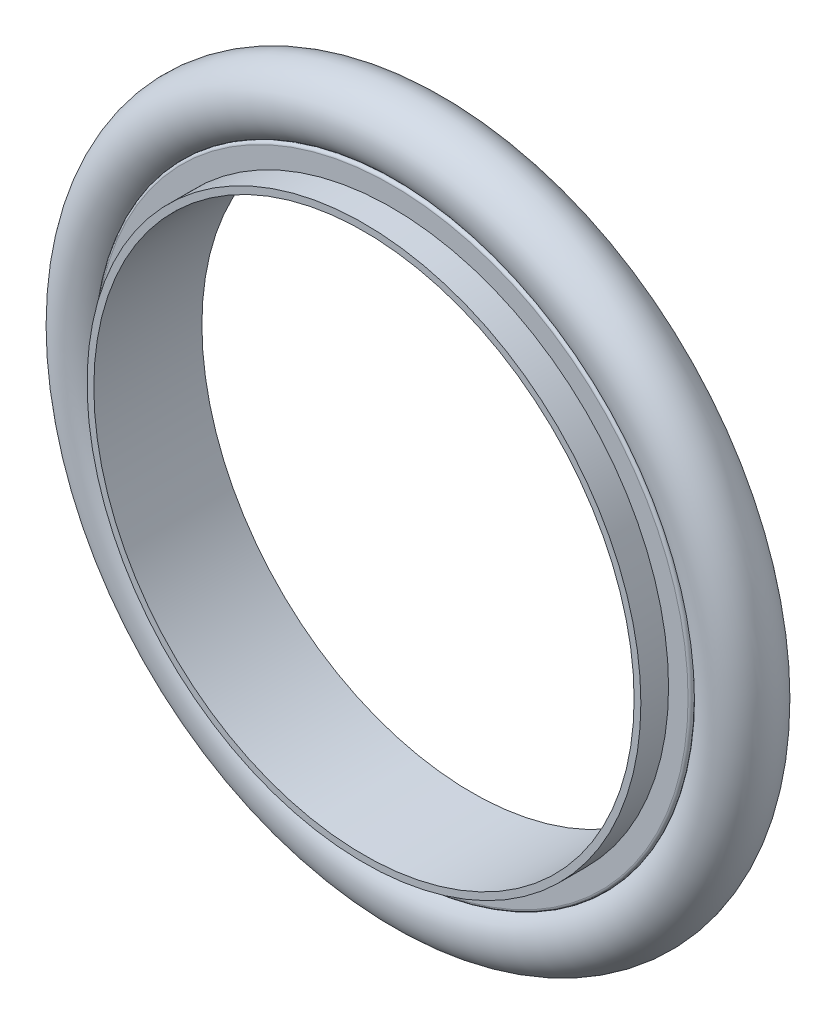
ISO-10303-21;
HEADER;
FILE_DESCRIPTION(('STEP AP214'),'2;1');
FILE_NAME('part.step','',(''),(''),'','','');
FILE_SCHEMA(('AUTOMOTIVE_DESIGN { 1 0 10303 214 1 1 1 1 }'));
ENDSEC;
DATA;
#1=APPLICATION_CONTEXT('core data for automotive mechanical design processes');
#2=APPLICATION_PROTOCOL_DEFINITION('international standard','automotive_design',2000,#1);
#3=PRODUCT_CONTEXT('',#1,'mechanical');
#4=PRODUCT('Part','Part','',(#3));
#5=PRODUCT_RELATED_PRODUCT_CATEGORY('part','',(#4));
#6=PRODUCT_DEFINITION_FORMATION('','',#4);
#7=PRODUCT_DEFINITION_CONTEXT('part definition',#1,'design');
#8=PRODUCT_DEFINITION('design','',#6,#7);
#9=PRODUCT_DEFINITION_SHAPE('','',#8);
#10=(LENGTH_UNIT() NAMED_UNIT(*) SI_UNIT(.MILLI.,.METRE.));
#11=(NAMED_UNIT(*) PLANE_ANGLE_UNIT() SI_UNIT($,.RADIAN.));
#12=(NAMED_UNIT(*) SI_UNIT($,.STERADIAN.) SOLID_ANGLE_UNIT());
#13=UNCERTAINTY_MEASURE_WITH_UNIT(LENGTH_MEASURE(1.E-05),#10,'distance_accuracy_value','');
#14=(GEOMETRIC_REPRESENTATION_CONTEXT(3) GLOBAL_UNCERTAINTY_ASSIGNED_CONTEXT((#13)) GLOBAL_UNIT_ASSIGNED_CONTEXT((#10,
#11,#12)) REPRESENTATION_CONTEXT('',''));
#15=CARTESIAN_POINT('',(0.,0.,0.));
#16=DIRECTION('',(0.,0.,1.));
#17=DIRECTION('',(1.,0.,0.));
#18=AXIS2_PLACEMENT_3D('',#15,#16,#17);
#19=CARTESIAN_POINT('',(0.,20.5,-4.));
#20=DIRECTION('',(0.,0.,1.));
#21=DIRECTION('',(1.,0.,0.));
#22=AXIS2_PLACEMENT_3D('',#19,#20,#21);
#23=PLANE('',#22);
#24=CARTESIAN_POINT('',(0.,0.,-4.));
#25=DIRECTION('',(0.,0.,-1.));
#26=DIRECTION('',(-1.,0.,0.));
#27=AXIS2_PLACEMENT_3D('',#24,#25,#26);
#28=CIRCLE('',#27,20.);
#29=CARTESIAN_POINT('',(20.,0.,-4.));
#30=VERTEX_POINT('',#29);
#31=EDGE_CURVE('E11',#30,#30,#28,.T.);
#32=ORIENTED_EDGE('',*,*,#31,.F.);
#33=EDGE_LOOP('',(#32));
#34=FACE_BOUND('',#33,.T.);
#35=CARTESIAN_POINT('',(0.,0.,-4.));
#36=DIRECTION('',(0.,0.,-1.));
#37=DIRECTION('',(-1.,0.,0.));
#38=AXIS2_PLACEMENT_3D('',#35,#36,#37);
#39=CIRCLE('',#38,20.5);
#40=CARTESIAN_POINT('',(20.5,0.,-4.));
#41=VERTEX_POINT('',#40);
#42=EDGE_CURVE('E93',#41,#41,#39,.T.);
#43=ORIENTED_EDGE('',*,*,#42,.T.);
#44=EDGE_LOOP('',(#43));
#45=FACE_BOUND('',#44,.T.);
#46=ADVANCED_FACE('F17',(#34,#45),#23,.F.);
#47=CARTESIAN_POINT('',(0.,20.5,-1.95));
#48=DIRECTION('',(0.,0.,1.));
#49=DIRECTION('',(1.,0.,0.));
#50=AXIS2_PLACEMENT_3D('',#47,#48,#49);
#51=PLANE('',#50);
#52=CARTESIAN_POINT('',(0.,0.,-1.95));
#53=DIRECTION('',(0.,0.,-1.));
#54=DIRECTION('',(-1.,0.,0.));
#55=AXIS2_PLACEMENT_3D('',#52,#53,#54);
#56=CIRCLE('',#55,20.5);
#57=CARTESIAN_POINT('',(20.5,0.,-1.95));
#58=VERTEX_POINT('',#57);
#59=EDGE_CURVE('E21',#58,#58,#56,.T.);
#60=ORIENTED_EDGE('',*,*,#59,.F.);
#61=EDGE_LOOP('',(#60));
#62=FACE_BOUND('',#61,.T.);
#63=CARTESIAN_POINT('',(0.,0.,-1.95));
#64=DIRECTION('',(0.,0.,-1.));
#65=DIRECTION('',(1.,0.,0.));
#66=AXIS2_PLACEMENT_3D('',#63,#64,#65);
#67=CIRCLE('',#66,21.9439114805048);
#68=CARTESIAN_POINT('',(21.9439114805048,0.,-1.95));
#69=VERTEX_POINT('',#68);
#70=EDGE_CURVE('E103',#69,#69,#67,.T.);
#71=ORIENTED_EDGE('',*,*,#70,.T.);
#72=EDGE_LOOP('',(#71));
#73=FACE_BOUND('',#72,.T.);
#74=ADVANCED_FACE('F19',(#62,#73),#51,.F.);
#75=CARTESIAN_POINT('',(0.,22.4355512152838,1.95));
#76=DIRECTION('',(0.,0.,-1.));
#77=DIRECTION('',(0.,-1.,0.));
#78=AXIS2_PLACEMENT_3D('',#75,#76,#77);
#79=PLANE('',#78);
#80=CARTESIAN_POINT('',(0.,0.,1.95));
#81=DIRECTION('',(0.,0.,-1.));
#82=DIRECTION('',(-1.,0.,0.));
#83=AXIS2_PLACEMENT_3D('',#80,#81,#82);
#84=CIRCLE('',#83,20.5);
#85=CARTESIAN_POINT('',(20.5,0.,1.95));
#86=VERTEX_POINT('',#85);
#87=EDGE_CURVE('E113',#86,#86,#84,.T.);
#88=ORIENTED_EDGE('',*,*,#87,.T.);
#89=EDGE_LOOP('',(#88));
#90=FACE_BOUND('',#89,.T.);
#91=CARTESIAN_POINT('',(0.,0.,1.95));
#92=DIRECTION('',(0.,0.,1.));
#93=DIRECTION('',(-1.,0.,0.));
#94=AXIS2_PLACEMENT_3D('',#91,#92,#93);
#95=CIRCLE('',#94,21.9439114805048);
#96=CARTESIAN_POINT('',(-21.9439114805048,0.,1.95));
#97=VERTEX_POINT('',#96);
#98=EDGE_CURVE('E91',#97,#97,#95,.T.);
#99=ORIENTED_EDGE('',*,*,#98,.T.);
#100=EDGE_LOOP('',(#99));
#101=FACE_BOUND('',#100,.T.);
#102=ADVANCED_FACE('F96',(#90,#101),#79,.F.);
#103=CARTESIAN_POINT('',(0.,20.,4.));
#104=DIRECTION('',(0.,0.,-1.));
#105=DIRECTION('',(0.,-1.,0.));
#106=AXIS2_PLACEMENT_3D('',#103,#104,#105);
#107=PLANE('',#106);
#108=CARTESIAN_POINT('',(0.,0.,4.));
#109=DIRECTION('',(0.,0.,-1.));
#110=DIRECTION('',(-1.,0.,0.));
#111=AXIS2_PLACEMENT_3D('',#108,#109,#110);
#112=CIRCLE('',#111,20.);
#113=CARTESIAN_POINT('',(20.,0.,4.));
#114=VERTEX_POINT('',#113);
#115=EDGE_CURVE('E109',#114,#114,#112,.T.);
#116=ORIENTED_EDGE('',*,*,#115,.T.);
#117=EDGE_LOOP('',(#116));
#118=FACE_BOUND('',#117,.T.);
#119=CARTESIAN_POINT('',(0.,0.,4.));
#120=DIRECTION('',(0.,0.,-1.));
#121=DIRECTION('',(-1.,0.,0.));
#122=AXIS2_PLACEMENT_3D('',#119,#120,#121);
#123=CIRCLE('',#122,20.5);
#124=CARTESIAN_POINT('',(20.5,0.,4.));
#125=VERTEX_POINT('',#124);
#126=EDGE_CURVE('E124',#125,#125,#123,.T.);
#127=ORIENTED_EDGE('',*,*,#126,.F.);
#128=EDGE_LOOP('',(#127));
#129=FACE_BOUND('',#128,.T.);
#130=ADVANCED_FACE('F161',(#118,#129),#107,.F.);
#131=CARTESIAN_POINT('',(0.,0.,0.));
#132=DIRECTION('',(0.,0.,-1.));
#133=DIRECTION('',(-1.,0.,0.));
#134=AXIS2_PLACEMENT_3D('',#131,#132,#133);
#135=CYLINDRICAL_SURFACE('',#134,20.);
#136=ORIENTED_EDGE('',*,*,#115,.F.);
#137=DIRECTION('',(0.,0.,-1.));
#138=VECTOR('',#137,1.);
#139=CARTESIAN_POINT('',(20.,0.,0.));
#140=LINE('',#139,#138);
#141=EDGE_CURVE('E28',#114,#30,#140,.T.);
#142=ORIENTED_EDGE('',*,*,#141,.T.);
#143=ORIENTED_EDGE('',*,*,#31,.T.);
#144=ORIENTED_EDGE('',*,*,#141,.F.);
#145=EDGE_LOOP('',(#136,#142,#143,#144));
#146=FACE_BOUND('',#145,.T.);
#147=ADVANCED_FACE('F165',(#146),#135,.F.);
#148=CARTESIAN_POINT('',(0.,0.,0.));
#149=DIRECTION('',(0.,0.,-1.));
#150=DIRECTION('',(-1.,0.,0.));
#151=AXIS2_PLACEMENT_3D('',#148,#149,#150);
#152=CYLINDRICAL_SURFACE('',#151,20.5);
#153=ORIENTED_EDGE('',*,*,#87,.F.);
#154=DIRECTION('',(0.,0.,1.));
#155=VECTOR('',#154,1.);
#156=CARTESIAN_POINT('',(20.5,0.,0.));
#157=LINE('',#156,#155);
#158=EDGE_CURVE('E116',#86,#125,#157,.T.);
#159=ORIENTED_EDGE('',*,*,#158,.T.);
#160=ORIENTED_EDGE('',*,*,#126,.T.);
#161=ORIENTED_EDGE('',*,*,#158,.F.);
#162=EDGE_LOOP('',(#153,#159,#160,#161));
#163=FACE_BOUND('',#162,.T.);
#164=ADVANCED_FACE('F163',(#163),#152,.T.);
#165=CARTESIAN_POINT('',(0.,0.,0.));
#166=DIRECTION('',(0.,0.,-1.));
#167=DIRECTION('',(-1.,0.,0.));
#168=AXIS2_PLACEMENT_3D('',#165,#166,#167);
#169=CYLINDRICAL_SURFACE('',#168,20.5);
#170=ORIENTED_EDGE('',*,*,#42,.F.);
#171=DIRECTION('',(0.,0.,1.));
#172=VECTOR('',#171,1.);
#173=CARTESIAN_POINT('',(20.5,0.,0.));
#174=LINE('',#173,#172);
#175=EDGE_CURVE('E110',#41,#58,#174,.T.);
#176=ORIENTED_EDGE('',*,*,#175,.T.);
#177=ORIENTED_EDGE('',*,*,#59,.T.);
#178=ORIENTED_EDGE('',*,*,#175,.F.);
#179=EDGE_LOOP('',(#170,#176,#177,#178));
#180=FACE_BOUND('',#179,.T.);
#181=ADVANCED_FACE('F132',(#180),#169,.T.);
#182=CARTESIAN_POINT('',(0.,0.,1.75));
#183=DIRECTION('',(0.,0.,1.));
#184=DIRECTION('',(1.,0.,0.));
#185=AXIS2_PLACEMENT_3D('',#182,#183,#184);
#186=TOROIDAL_SURFACE('',#185,21.9439114805048,0.2);
#187=ORIENTED_EDGE('',*,*,#98,.F.);
#188=CARTESIAN_POINT('',(-21.9439114805048,0.,1.75));
#189=DIRECTION('',(0.,-1.,0.));
#190=DIRECTION('',(-1.,0.,0.));
#191=AXIS2_PLACEMENT_3D('',#188,#189,#190);
#192=CIRCLE('',#191,0.2);
#193=CARTESIAN_POINT('',(-22.0962143338007,0.,1.6203703703704));
#194=VERTEX_POINT('',#193);
#195=EDGE_CURVE('E88',#97,#194,#192,.T.);
#196=ORIENTED_EDGE('',*,*,#195,.T.);
#197=CARTESIAN_POINT('',(0.,0.,1.6203703703704));
#198=DIRECTION('',(0.,0.,-1.));
#199=DIRECTION('',(-1.,0.,0.));
#200=AXIS2_PLACEMENT_3D('',#197,#198,#199);
#201=CIRCLE('',#200,22.0962143338007);
#202=CARTESIAN_POINT('',(22.0962143338007,0.,1.6203703703704));
#203=VERTEX_POINT('',#202);
#204=EDGE_CURVE('E143',#203,#194,#201,.T.);
#205=ORIENTED_EDGE('',*,*,#204,.F.);
#206=CARTESIAN_POINT('',(0.,0.,1.6203703703704));
#207=DIRECTION('',(0.,0.,-1.));
#208=DIRECTION('',(-1.,0.,0.));
#209=AXIS2_PLACEMENT_3D('',#206,#207,#208);
#210=CIRCLE('',#209,22.0962143338007);
#211=EDGE_CURVE('E65',#194,#203,#210,.T.);
#212=ORIENTED_EDGE('',*,*,#211,.F.);
#213=ORIENTED_EDGE('',*,*,#195,.F.);
#214=EDGE_LOOP('',(#187,#196,#205,#212,#213));
#215=FACE_BOUND('',#214,.T.);
#216=ADVANCED_FACE('F90',(#215),#186,.T.);
#217=CARTESIAN_POINT('',(0.,0.,-1.75));
#218=DIRECTION('',(0.,0.,-1.));
#219=DIRECTION('',(-1.,0.,0.));
#220=AXIS2_PLACEMENT_3D('',#217,#218,#219);
#221=TOROIDAL_SURFACE('',#220,21.9439114805048,0.2);
#222=ORIENTED_EDGE('',*,*,#70,.F.);
#223=CARTESIAN_POINT('',(21.9439114805048,0.,-1.75));
#224=DIRECTION('',(0.,-1.,0.));
#225=DIRECTION('',(1.,0.,0.));
#226=AXIS2_PLACEMENT_3D('',#223,#224,#225);
#227=CIRCLE('',#226,0.2);
#228=CARTESIAN_POINT('',(22.0962143338007,0.,-1.62037037037042));
#229=VERTEX_POINT('',#228);
#230=EDGE_CURVE('E81',#69,#229,#227,.T.);
#231=ORIENTED_EDGE('',*,*,#230,.T.);
#232=CARTESIAN_POINT('',(0.,0.,-1.62037037037042));
#233=DIRECTION('',(0.,0.,1.));
#234=DIRECTION('',(1.,0.,0.));
#235=AXIS2_PLACEMENT_3D('',#232,#233,#234);
#236=CIRCLE('',#235,22.0962143338007);
#237=EDGE_CURVE('E197',#229,#229,#236,.T.);
#238=ORIENTED_EDGE('',*,*,#237,.F.);
#239=ORIENTED_EDGE('',*,*,#230,.F.);
#240=EDGE_LOOP('',(#222,#231,#238,#239));
#241=FACE_BOUND('',#240,.T.);
#242=ADVANCED_FACE('F230',(#241),#221,.T.);
#243=CARTESIAN_POINT('',(0.,0.,0.));
#244=DIRECTION('',(0.,0.,-1.));
#245=DIRECTION('',(-1.,0.,0.));
#246=AXIS2_PLACEMENT_3D('',#243,#244,#245);
#247=TOROIDAL_SURFACE('',#246,24.,2.5);
#248=ORIENTED_EDGE('',*,*,#237,.T.);
#249=CARTESIAN_POINT('',(24.,0.,0.));
#250=DIRECTION('',(0.,-1.,0.));
#251=DIRECTION('',(1.,0.,0.));
#252=AXIS2_PLACEMENT_3D('',#249,#250,#251);
#253=CIRCLE('',#252,2.5);
#254=EDGE_CURVE('E192',#229,#203,#253,.T.);
#255=ORIENTED_EDGE('',*,*,#254,.T.);
#256=ORIENTED_EDGE('',*,*,#204,.T.);
#257=ORIENTED_EDGE('',*,*,#211,.T.);
#258=ORIENTED_EDGE('',*,*,#254,.F.);
#259=EDGE_LOOP('',(#248,#255,#256,#257,#258));
#260=FACE_BOUND('',#259,.T.);
#261=ADVANCED_FACE('F214',(#260),#247,.T.);
#262=CLOSED_SHELL('',(#46,#74,#102,#130,#147,#164,#181,#216,#242,#261));
#263=MANIFOLD_SOLID_BREP('B1',#262);
#264=ADVANCED_BREP_SHAPE_REPRESENTATION('',(#18,#263),#14);
#265=SHAPE_DEFINITION_REPRESENTATION(#9,#264);
ENDSEC;
END-ISO-10303-21;
